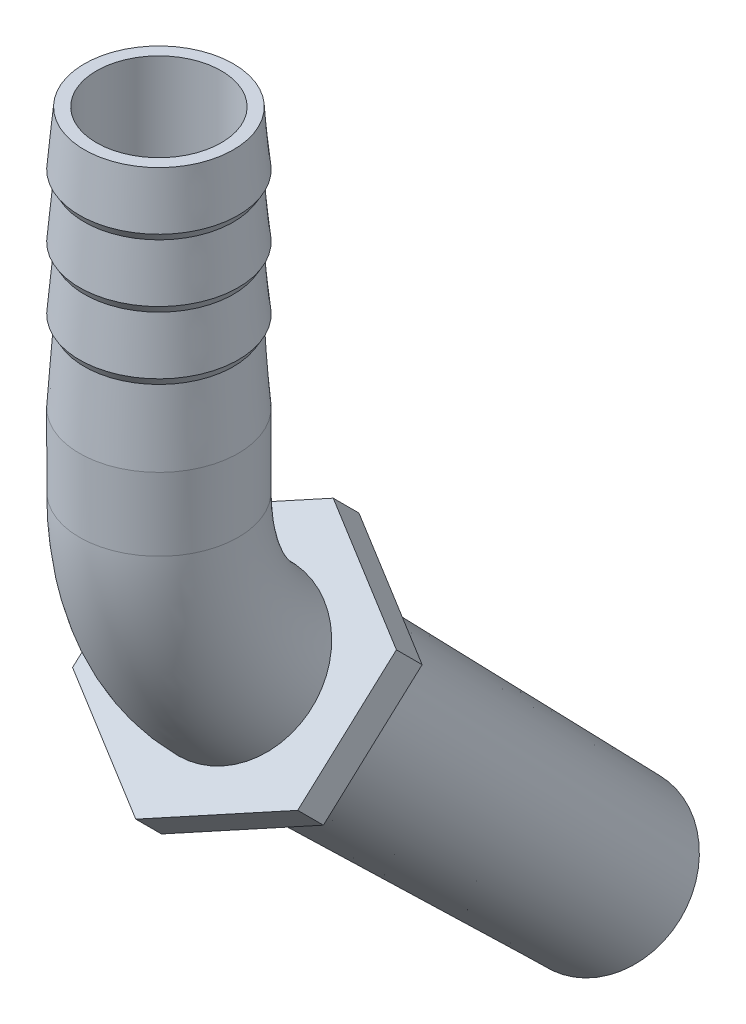
ISO-10303-21;
HEADER;
FILE_DESCRIPTION(('STEP AP214'),'2;1');
FILE_NAME('part.step','',(''),(''),'','','');
FILE_SCHEMA(('AUTOMOTIVE_DESIGN { 1 0 10303 214 1 1 1 1 }'));
ENDSEC;
DATA;
#1=APPLICATION_CONTEXT('core data for automotive mechanical design processes');
#2=APPLICATION_PROTOCOL_DEFINITION('international standard','automotive_design',2000,#1);
#3=PRODUCT_CONTEXT('',#1,'mechanical');
#4=PRODUCT('Part','Part','',(#3));
#5=PRODUCT_RELATED_PRODUCT_CATEGORY('part','',(#4));
#6=PRODUCT_DEFINITION_FORMATION('','',#4);
#7=PRODUCT_DEFINITION_CONTEXT('part definition',#1,'design');
#8=PRODUCT_DEFINITION('design','',#6,#7);
#9=PRODUCT_DEFINITION_SHAPE('','',#8);
#10=(LENGTH_UNIT() NAMED_UNIT(*) SI_UNIT(.MILLI.,.METRE.));
#11=(NAMED_UNIT(*) PLANE_ANGLE_UNIT() SI_UNIT($,.RADIAN.));
#12=(NAMED_UNIT(*) SI_UNIT($,.STERADIAN.) SOLID_ANGLE_UNIT());
#13=UNCERTAINTY_MEASURE_WITH_UNIT(LENGTH_MEASURE(1.E-05),#10,'distance_accuracy_value','');
#14=(GEOMETRIC_REPRESENTATION_CONTEXT(3) GLOBAL_UNCERTAINTY_ASSIGNED_CONTEXT((#13)) GLOBAL_UNIT_ASSIGNED_CONTEXT((#10,
#11,#12)) REPRESENTATION_CONTEXT('',''));
#15=CARTESIAN_POINT('',(0.,0.,0.));
#16=DIRECTION('',(0.,0.,1.));
#17=DIRECTION('',(1.,0.,0.));
#18=AXIS2_PLACEMENT_3D('',#15,#16,#17);
#19=CARTESIAN_POINT('',(3.25,47.7,0.));
#20=DIRECTION('',(0.,1.,0.));
#21=DIRECTION('',(0.,0.,1.));
#22=AXIS2_PLACEMENT_3D('',#19,#20,#21);
#23=PLANE('',#22);
#24=CARTESIAN_POINT('',(0.,47.7,0.));
#25=DIRECTION('',(0.,1.,0.));
#26=DIRECTION('',(0.,0.,1.));
#27=AXIS2_PLACEMENT_3D('',#24,#25,#26);
#28=CIRCLE('',#27,5.15);
#29=CARTESIAN_POINT('',(0.,47.7,5.15));
#30=VERTEX_POINT('',#29);
#31=EDGE_CURVE('E149',#30,#30,#28,.T.);
#32=ORIENTED_EDGE('',*,*,#31,.F.);
#33=EDGE_LOOP('',(#32));
#34=FACE_BOUND('',#33,.T.);
#35=CARTESIAN_POINT('',(0.,47.7,0.));
#36=DIRECTION('',(0.,-1.,0.));
#37=DIRECTION('',(0.,0.,-1.));
#38=AXIS2_PLACEMENT_3D('',#35,#36,#37);
#39=CIRCLE('',#38,6.15);
#40=CARTESIAN_POINT('',(0.,47.7,-6.15));
#41=VERTEX_POINT('',#40);
#42=EDGE_CURVE('E44',#41,#41,#39,.T.);
#43=ORIENTED_EDGE('',*,*,#42,.F.);
#44=EDGE_LOOP('',(#43));
#45=FACE_BOUND('',#44,.T.);
#46=ADVANCED_FACE('F36',(#34,#45),#23,.T.);
#47=CARTESIAN_POINT('',(0.,43.217813033797,0.));
#48=DIRECTION('',(0.,-1.,0.));
#49=DIRECTION('',(0.,0.,-1.));
#50=AXIS2_PLACEMENT_3D('',#47,#48,#49);
#51=CONICAL_SURFACE('',#50,6.55,0.0890063623805471);
#52=ORIENTED_EDGE('',*,*,#42,.T.);
#53=EDGE_LOOP('',(#52));
#54=FACE_BOUND('',#53,.T.);
#55=CARTESIAN_POINT('',(0.,43.217813033797,0.));
#56=DIRECTION('',(0.,-1.,0.));
#57=DIRECTION('',(0.,0.,-1.));
#58=AXIS2_PLACEMENT_3D('',#55,#56,#57);
#59=CIRCLE('',#58,6.55);
#60=CARTESIAN_POINT('',(0.,43.217813033797,-6.55));
#61=VERTEX_POINT('',#60);
#62=EDGE_CURVE('E174',#61,#61,#59,.T.);
#63=ORIENTED_EDGE('',*,*,#62,.F.);
#64=EDGE_LOOP('',(#63));
#65=FACE_BOUND('',#64,.T.);
#66=ADVANCED_FACE('F179',(#54,#65),#51,.T.);
#67=CARTESIAN_POINT('',(0.,42.5333333333333,0.));
#68=DIRECTION('',(0.,1.,0.));
#69=DIRECTION('',(0.,0.,1.));
#70=AXIS2_PLACEMENT_3D('',#67,#68,#69);
#71=CONICAL_SURFACE('',#70,6.15,0.528859112138031);
#72=ORIENTED_EDGE('',*,*,#62,.T.);
#73=EDGE_LOOP('',(#72));
#74=FACE_BOUND('',#73,.T.);
#75=CARTESIAN_POINT('',(0.,42.5333333333333,0.));
#76=DIRECTION('',(0.,-1.,0.));
#77=DIRECTION('',(0.,0.,-1.));
#78=AXIS2_PLACEMENT_3D('',#75,#76,#77);
#79=CIRCLE('',#78,6.15);
#80=CARTESIAN_POINT('',(0.,42.5333333333333,-6.15));
#81=VERTEX_POINT('',#80);
#82=EDGE_CURVE('E171',#81,#81,#79,.T.);
#83=ORIENTED_EDGE('',*,*,#82,.F.);
#84=EDGE_LOOP('',(#83));
#85=FACE_BOUND('',#84,.T.);
#86=ADVANCED_FACE('F187',(#74,#85),#71,.T.);
#87=CARTESIAN_POINT('',(0.,38.0511463671304,0.));
#88=DIRECTION('',(0.,-1.,0.));
#89=DIRECTION('',(0.,0.,-1.));
#90=AXIS2_PLACEMENT_3D('',#87,#88,#89);
#91=CONICAL_SURFACE('',#90,6.55,0.0890063623805471);
#92=ORIENTED_EDGE('',*,*,#82,.T.);
#93=EDGE_LOOP('',(#92));
#94=FACE_BOUND('',#93,.T.);
#95=CARTESIAN_POINT('',(0.,38.0511463671304,0.));
#96=DIRECTION('',(0.,-1.,0.));
#97=DIRECTION('',(0.,0.,-1.));
#98=AXIS2_PLACEMENT_3D('',#95,#96,#97);
#99=CIRCLE('',#98,6.55);
#100=CARTESIAN_POINT('',(0.,38.0511463671304,-6.55));
#101=VERTEX_POINT('',#100);
#102=EDGE_CURVE('E168',#101,#101,#99,.T.);
#103=ORIENTED_EDGE('',*,*,#102,.F.);
#104=EDGE_LOOP('',(#103));
#105=FACE_BOUND('',#104,.T.);
#106=ADVANCED_FACE('F234',(#94,#105),#91,.T.);
#107=CARTESIAN_POINT('',(0.,37.3666666666667,0.));
#108=DIRECTION('',(0.,1.,0.));
#109=DIRECTION('',(0.,0.,1.));
#110=AXIS2_PLACEMENT_3D('',#107,#108,#109);
#111=CONICAL_SURFACE('',#110,6.15,0.528859112138035);
#112=ORIENTED_EDGE('',*,*,#102,.T.);
#113=EDGE_LOOP('',(#112));
#114=FACE_BOUND('',#113,.T.);
#115=CARTESIAN_POINT('',(0.,37.3666666666667,0.));
#116=DIRECTION('',(0.,-1.,0.));
#117=DIRECTION('',(0.,0.,-1.));
#118=AXIS2_PLACEMENT_3D('',#115,#116,#117);
#119=CIRCLE('',#118,6.15);
#120=CARTESIAN_POINT('',(0.,37.3666666666667,-6.15));
#121=VERTEX_POINT('',#120);
#122=EDGE_CURVE('E165',#121,#121,#119,.T.);
#123=ORIENTED_EDGE('',*,*,#122,.F.);
#124=EDGE_LOOP('',(#123));
#125=FACE_BOUND('',#124,.T.);
#126=ADVANCED_FACE('F230',(#114,#125),#111,.T.);
#127=CARTESIAN_POINT('',(0.,32.8844797004637,0.));
#128=DIRECTION('',(0.,-1.,0.));
#129=DIRECTION('',(0.,0.,-1.));
#130=AXIS2_PLACEMENT_3D('',#127,#128,#129);
#131=CONICAL_SURFACE('',#130,6.55,0.089006362380547);
#132=ORIENTED_EDGE('',*,*,#122,.T.);
#133=EDGE_LOOP('',(#132));
#134=FACE_BOUND('',#133,.T.);
#135=CARTESIAN_POINT('',(0.,32.8844797004637,0.));
#136=DIRECTION('',(0.,-1.,0.));
#137=DIRECTION('',(0.,0.,-1.));
#138=AXIS2_PLACEMENT_3D('',#135,#136,#137);
#139=CIRCLE('',#138,6.55);
#140=CARTESIAN_POINT('',(0.,32.8844797004637,-6.55));
#141=VERTEX_POINT('',#140);
#142=EDGE_CURVE('E162',#141,#141,#139,.T.);
#143=ORIENTED_EDGE('',*,*,#142,.F.);
#144=EDGE_LOOP('',(#143));
#145=FACE_BOUND('',#144,.T.);
#146=ADVANCED_FACE('F226',(#134,#145),#131,.T.);
#147=CARTESIAN_POINT('',(0.,32.2,0.));
#148=DIRECTION('',(0.,1.,0.));
#149=DIRECTION('',(0.,0.,1.));
#150=AXIS2_PLACEMENT_3D('',#147,#148,#149);
#151=CONICAL_SURFACE('',#150,6.15,0.528859112138035);
#152=ORIENTED_EDGE('',*,*,#142,.T.);
#153=EDGE_LOOP('',(#152));
#154=FACE_BOUND('',#153,.T.);
#155=CARTESIAN_POINT('',(0.,32.2,0.));
#156=DIRECTION('',(0.,-1.,0.));
#157=DIRECTION('',(0.,0.,-1.));
#158=AXIS2_PLACEMENT_3D('',#155,#156,#157);
#159=CIRCLE('',#158,6.15);
#160=CARTESIAN_POINT('',(0.,32.2,-6.15));
#161=VERTEX_POINT('',#160);
#162=EDGE_CURVE('E159',#161,#161,#159,.T.);
#163=ORIENTED_EDGE('',*,*,#162,.F.);
#164=EDGE_LOOP('',(#163));
#165=FACE_BOUND('',#164,.T.);
#166=ADVANCED_FACE('F222',(#154,#165),#151,.T.);
#167=CARTESIAN_POINT('',(0.,26.2,0.));
#168=DIRECTION('',(0.,-1.,0.));
#169=DIRECTION('',(0.,0.,-1.));
#170=AXIS2_PLACEMENT_3D('',#167,#168,#169);
#171=CONICAL_SURFACE('',#170,6.55,0.0665681637758236);
#172=ORIENTED_EDGE('',*,*,#162,.T.);
#173=EDGE_LOOP('',(#172));
#174=FACE_BOUND('',#173,.T.);
#175=CARTESIAN_POINT('',(0.,26.2,0.));
#176=DIRECTION('',(0.,-1.,0.));
#177=DIRECTION('',(0.,0.,-1.));
#178=AXIS2_PLACEMENT_3D('',#175,#176,#177);
#179=CIRCLE('',#178,6.55);
#180=CARTESIAN_POINT('',(0.,26.2,-6.55));
#181=VERTEX_POINT('',#180);
#182=EDGE_CURVE('E156',#181,#181,#179,.T.);
#183=ORIENTED_EDGE('',*,*,#182,.F.);
#184=EDGE_LOOP('',(#183));
#185=FACE_BOUND('',#184,.T.);
#186=ADVANCED_FACE('F218',(#174,#185),#171,.T.);
#187=CARTESIAN_POINT('',(0.,0.,0.));
#188=DIRECTION('',(0.,-1.,0.));
#189=DIRECTION('',(0.,0.,-1.));
#190=AXIS2_PLACEMENT_3D('',#187,#188,#189);
#191=CYLINDRICAL_SURFACE('',#190,6.55);
#192=ORIENTED_EDGE('',*,*,#182,.T.);
#193=EDGE_LOOP('',(#192));
#194=FACE_BOUND('',#193,.T.);
#195=CARTESIAN_POINT('',(0.,20.2,0.));
#196=DIRECTION('',(0.,-1.,0.));
#197=DIRECTION('',(0.,0.,-1.));
#198=AXIS2_PLACEMENT_3D('',#195,#196,#197);
#199=CIRCLE('',#198,6.55);
#200=CARTESIAN_POINT('',(0.,20.2,6.55));
#201=VERTEX_POINT('',#200);
#202=EDGE_CURVE('E141',#201,#201,#199,.T.);
#203=ORIENTED_EDGE('',*,*,#202,.F.);
#204=EDGE_LOOP('',(#203));
#205=FACE_BOUND('',#204,.T.);
#206=ADVANCED_FACE('F194',(#194,#205),#191,.T.);
#207=CARTESIAN_POINT('',(0.,7.63360030755712,0.));
#208=DIRECTION('',(0.,1.,0.));
#209=DIRECTION('',(0.,0.,1.));
#210=AXIS2_PLACEMENT_3D('',#207,#208,#209);
#211=CYLINDRICAL_SURFACE('',#210,5.15);
#212=ORIENTED_EDGE('',*,*,#31,.T.);
#213=EDGE_LOOP('',(#212));
#214=FACE_BOUND('',#213,.T.);
#215=CARTESIAN_POINT('',(0.,20.2,0.));
#216=DIRECTION('',(0.,-1.,0.));
#217=DIRECTION('',(0.,0.,-1.));
#218=AXIS2_PLACEMENT_3D('',#215,#216,#217);
#219=CIRCLE('',#218,5.15);
#220=CARTESIAN_POINT('',(0.,20.2,5.15000000000001));
#221=VERTEX_POINT('',#220);
#222=EDGE_CURVE('E142',#221,#221,#219,.F.);
#223=ORIENTED_EDGE('',*,*,#222,.F.);
#224=EDGE_LOOP('',(#223));
#225=FACE_BOUND('',#224,.T.);
#226=ADVANCED_FACE('F190',(#214,#225),#211,.F.);
#227=CARTESIAN_POINT('',(0.,20.2,-21.3022261236142));
#228=DIRECTION('',(1.,0.,0.));
#229=DIRECTION('',(0.,0.,-1.));
#230=AXIS2_PLACEMENT_3D('',#227,#228,#229);
#231=TOROIDAL_SURFACE('',#230,21.3022261236142,6.55);
#232=CARTESIAN_POINT('',(0.,5.13705145362328,-6.23927757723729));
#233=DIRECTION('',(0.,-0.707106781186551,-0.707106781186544));
#234=DIRECTION('',(0.,0.707106781186544,-0.707106781186551));
#235=AXIS2_PLACEMENT_3D('',#232,#233,#234);
#236=CIRCLE('',#235,6.55);
#237=CARTESIAN_POINT('',(0.,0.505502036851416,-1.60772816046538));
#238=VERTEX_POINT('',#237);
#239=EDGE_CURVE('E146',#238,#238,#236,.T.);
#240=CARTESIAN_POINT('',(0.,20.2,-21.3022261236142));
#241=DIRECTION('',(1.,0.,0.));
#242=DIRECTION('',(0.,0.,-1.));
#243=AXIS2_PLACEMENT_3D('',#240,#241,#242);
#244=CIRCLE('',#243,27.8522261236142);
#245=EDGE_CURVE('',#201,#238,#244,.T.);
#246=ORIENTED_EDGE('',*,*,#202,.T.);
#247=ORIENTED_EDGE('',*,*,#239,.F.);
#248=ORIENTED_EDGE('',*,*,#245,.T.);
#249=ORIENTED_EDGE('',*,*,#245,.F.);
#250=EDGE_LOOP('',(#246,#248,#247,#249));
#251=FACE_BOUND('',#250,.T.);
#252=ADVANCED_FACE('F193',(#251),#231,.T.);
#253=CARTESIAN_POINT('',(0.,20.2,-21.3022261236142));
#254=DIRECTION('',(1.,0.,0.));
#255=DIRECTION('',(0.,0.,-1.));
#256=AXIS2_PLACEMENT_3D('',#253,#254,#255);
#257=TOROIDAL_SURFACE('',#256,21.3022261236142,5.15);
#258=CARTESIAN_POINT('',(0.,5.13705145362328,-6.23927757723729));
#259=DIRECTION('',(0.,-0.707106781186551,-0.707106781186544));
#260=DIRECTION('',(0.,0.707106781186544,-0.707106781186551));
#261=AXIS2_PLACEMENT_3D('',#258,#259,#260);
#262=CIRCLE('',#261,5.15);
#263=CARTESIAN_POINT('',(0.,1.49545153051258,-2.59767765412655));
#264=VERTEX_POINT('',#263);
#265=EDGE_CURVE('E145',#264,#264,#262,.F.);
#266=CARTESIAN_POINT('',(0.,20.2,-21.3022261236142));
#267=DIRECTION('',(1.,0.,0.));
#268=DIRECTION('',(0.,0.,-1.));
#269=AXIS2_PLACEMENT_3D('',#266,#267,#268);
#270=CIRCLE('',#269,26.4522261236142);
#271=EDGE_CURVE('',#221,#264,#270,.T.);
#272=ORIENTED_EDGE('',*,*,#222,.T.);
#273=ORIENTED_EDGE('',*,*,#265,.F.);
#274=ORIENTED_EDGE('',*,*,#271,.T.);
#275=ORIENTED_EDGE('',*,*,#271,.F.);
#276=EDGE_LOOP('',(#272,#274,#273,#275));
#277=FACE_BOUND('',#276,.T.);
#278=ADVANCED_FACE('F196',(#277),#257,.F.);
#279=CARTESIAN_POINT('',(0.,-2.67243340536663,-2.67243340536661));
#280=DIRECTION('',(0.,-0.707106781186551,-0.707106781186544));
#281=DIRECTION('',(0.,0.707106781186544,-0.707106781186551));
#282=AXIS2_PLACEMENT_3D('',#279,#280,#281);
#283=PLANE('',#282);
#284=CARTESIAN_POINT('',(0.,3.01573111006362,-8.36059792079695));
#285=DIRECTION('',(0.,-0.707106781186551,-0.707106781186544));
#286=DIRECTION('',(0.,0.707106781186544,-0.707106781186551));
#287=AXIS2_PLACEMENT_3D('',#284,#285,#286);
#288=CIRCLE('',#287,7.15);
#289=CARTESIAN_POINT('',(0.,8.0715445955474,-13.4164114062808));
#290=VERTEX_POINT('',#289);
#291=EDGE_CURVE('E12',#290,#290,#288,.T.);
#292=ORIENTED_EDGE('',*,*,#291,.F.);
#293=EDGE_LOOP('',(#292));
#294=FACE_BOUND('',#293,.T.);
#295=DIRECTION('',(0.848471634680625,-0.374229799149122,0.374229799149126));
#296=VECTOR('',#295,1.);
#297=CARTESIAN_POINT('',(0.375051930091136,10.7883380102527,-16.1332048209861));
#298=LINE('',#297,#296);
#299=CARTESIAN_POINT('',(0.375051930091136,10.7883380102527,-16.1332048209861));
#300=VERTEX_POINT('',#299);
#301=CARTESIAN_POINT('',(9.70698640339507,6.67236309621584,-12.0172299069492));
#302=VERTEX_POINT('',#301);
#303=EDGE_CURVE('E132',#300,#302,#298,.T.);
#304=ORIENTED_EDGE('',*,*,#303,.T.);
#305=DIRECTION('',(-0.034100209889482,-0.706695541122725,0.706695541122733));
#306=VECTOR('',#305,1.);
#307=CARTESIAN_POINT('',(9.70698640339507,6.67236309621584,-12.0172299069492));
#308=LINE('',#307,#306);
#309=CARTESIAN_POINT('',(9.33193447330393,-1.10024380397324,-4.24462300676002));
#310=VERTEX_POINT('',#309);
#311=EDGE_CURVE('E90',#302,#310,#308,.T.);
#312=ORIENTED_EDGE('',*,*,#311,.T.);
#313=DIRECTION('',(-0.882571844570107,-0.332465741973603,0.332465741973607));
#314=VECTOR('',#313,1.);
#315=CARTESIAN_POINT('',(9.33193447330393,-1.10024380397324,-4.24462300676002));
#316=LINE('',#315,#314);
#317=CARTESIAN_POINT('',(-0.375051930091139,-4.75687579012545,-0.587991020607762));
#318=VERTEX_POINT('',#317);
#319=EDGE_CURVE('E103',#310,#318,#316,.T.);
#320=ORIENTED_EDGE('',*,*,#319,.T.);
#321=DIRECTION('',(-0.848471634680625,0.374229799149122,-0.374229799149126));
#322=VECTOR('',#321,1.);
#323=CARTESIAN_POINT('',(-0.375051930091139,-4.75687579012545,-0.587991020607762));
#324=LINE('',#323,#322);
#325=CARTESIAN_POINT('',(-9.70698640339507,-0.640900876088596,-4.70396593464466));
#326=VERTEX_POINT('',#325);
#327=EDGE_CURVE('E97',#318,#326,#324,.T.);
#328=ORIENTED_EDGE('',*,*,#327,.T.);
#329=DIRECTION('',(0.034100209889482,0.706695541122725,-0.706695541122733));
#330=VECTOR('',#329,1.);
#331=CARTESIAN_POINT('',(-9.70698640339507,-0.640900876088596,-4.70396593464466));
#332=LINE('',#331,#330);
#333=CARTESIAN_POINT('',(-9.33193447330393,7.13170602410048,-12.4765728348338));
#334=VERTEX_POINT('',#333);
#335=EDGE_CURVE('E101',#326,#334,#332,.T.);
#336=ORIENTED_EDGE('',*,*,#335,.T.);
#337=DIRECTION('',(0.882571844570107,0.332465741973603,-0.332465741973607));
#338=VECTOR('',#337,1.);
#339=CARTESIAN_POINT('',(-9.33193447330393,7.13170602410048,-12.4765728348338));
#340=LINE('',#339,#338);
#341=EDGE_CURVE('E52',#334,#300,#340,.T.);
#342=ORIENTED_EDGE('',*,*,#341,.T.);
#343=EDGE_LOOP('',(#304,#312,#320,#328,#336,#342));
#344=FACE_BOUND('',#343,.T.);
#345=ADVANCED_FACE('F99',(#294,#344),#283,.T.);
#346=CARTESIAN_POINT('',(0.,-0.55111306180698,-0.551113061806974));
#347=DIRECTION('',(0.,-0.707106781186551,-0.707106781186544));
#348=DIRECTION('',(0.,0.707106781186544,-0.707106781186551));
#349=AXIS2_PLACEMENT_3D('',#346,#347,#348);
#350=PLANE('',#349);
#351=ORIENTED_EDGE('',*,*,#239,.T.);
#352=EDGE_LOOP('',(#351));
#353=FACE_BOUND('',#352,.T.);
#354=DIRECTION('',(0.848471634680625,-0.374229799149122,0.374229799149126));
#355=VECTOR('',#354,1.);
#356=CARTESIAN_POINT('',(0.375051930091136,12.9096583538124,-14.0118844774265));
#357=LINE('',#356,#355);
#358=CARTESIAN_POINT('',(0.375051930091136,12.9096583538124,-14.0118844774265));
#359=VERTEX_POINT('',#358);
#360=CARTESIAN_POINT('',(9.70698640339507,8.79368343977549,-9.89590956338955));
#361=VERTEX_POINT('',#360);
#362=EDGE_CURVE('E121',#359,#361,#357,.T.);
#363=ORIENTED_EDGE('',*,*,#362,.F.);
#364=DIRECTION('',(0.882571844570107,0.332465741973603,-0.332465741973607));
#365=VECTOR('',#364,1.);
#366=CARTESIAN_POINT('',(-9.33193447330393,9.25302636766014,-10.3552524912742));
#367=LINE('',#366,#365);
#368=CARTESIAN_POINT('',(-9.33193447330393,9.25302636766014,-10.3552524912742));
#369=VERTEX_POINT('',#368);
#370=EDGE_CURVE('E81',#369,#359,#367,.T.);
#371=ORIENTED_EDGE('',*,*,#370,.F.);
#372=DIRECTION('',(0.034100209889482,0.706695541122725,-0.706695541122733));
#373=VECTOR('',#372,1.);
#374=CARTESIAN_POINT('',(-9.70698640339507,1.48041946747106,-2.58264559108503));
#375=LINE('',#374,#373);
#376=CARTESIAN_POINT('',(-9.70698640339507,1.48041946747106,-2.58264559108503));
#377=VERTEX_POINT('',#376);
#378=EDGE_CURVE('E75',#377,#369,#375,.T.);
#379=ORIENTED_EDGE('',*,*,#378,.F.);
#380=DIRECTION('',(-0.848471634680625,0.374229799149122,-0.374229799149126));
#381=VECTOR('',#380,1.);
#382=CARTESIAN_POINT('',(-0.375051930091139,-2.6355554465658,1.53332932295187));
#383=LINE('',#382,#381);
#384=CARTESIAN_POINT('',(-0.375051930091139,-2.6355554465658,1.53332932295187));
#385=VERTEX_POINT('',#384);
#386=EDGE_CURVE('E111',#385,#377,#383,.T.);
#387=ORIENTED_EDGE('',*,*,#386,.F.);
#388=DIRECTION('',(-0.882571844570107,-0.332465741973603,0.332465741973607));
#389=VECTOR('',#388,1.);
#390=CARTESIAN_POINT('',(9.33193447330393,1.02107653958642,-2.12330266320039));
#391=LINE('',#390,#389);
#392=CARTESIAN_POINT('',(9.33193447330393,1.02107653958642,-2.12330266320039));
#393=VERTEX_POINT('',#392);
#394=EDGE_CURVE('E127',#393,#385,#391,.T.);
#395=ORIENTED_EDGE('',*,*,#394,.F.);
#396=DIRECTION('',(-0.034100209889482,-0.706695541122725,0.706695541122733));
#397=VECTOR('',#396,1.);
#398=CARTESIAN_POINT('',(9.70698640339507,8.79368343977549,-9.89590956338955));
#399=LINE('',#398,#397);
#400=EDGE_CURVE('E124',#361,#393,#399,.T.);
#401=ORIENTED_EDGE('',*,*,#400,.F.);
#402=EDGE_LOOP('',(#363,#371,#379,#387,#395,#401));
#403=FACE_BOUND('',#402,.T.);
#404=ADVANCED_FACE('F206',(#353,#403),#350,.F.);
#405=CARTESIAN_POINT('',(0.375051930091136,10.7883380102527,-16.1332048209861));
#406=DIRECTION('',(-0.529240857400851,-0.599960046527102,0.599960046527108));
#407=DIRECTION('',(0.,-0.707106781186551,-0.707106781186544));
#408=AXIS2_PLACEMENT_3D('',#405,#406,#407);
#409=PLANE('',#408);
#410=ORIENTED_EDGE('',*,*,#362,.T.);
#411=DIRECTION('',(0.,0.707106781186551,0.707106781186544));
#412=VECTOR('',#411,1.);
#413=CARTESIAN_POINT('',(9.70698640339507,6.67236309621584,-12.0172299069492));
#414=LINE('',#413,#412);
#415=EDGE_CURVE('E139',#302,#361,#414,.T.);
#416=ORIENTED_EDGE('',*,*,#415,.F.);
#417=ORIENTED_EDGE('',*,*,#303,.F.);
#418=DIRECTION('',(0.,0.707106781186551,0.707106781186544));
#419=VECTOR('',#418,1.);
#420=CARTESIAN_POINT('',(0.375051930091136,10.7883380102527,-16.1332048209861));
#421=LINE('',#420,#419);
#422=EDGE_CURVE('E117',#300,#359,#421,.T.);
#423=ORIENTED_EDGE('',*,*,#422,.T.);
#424=EDGE_LOOP('',(#410,#416,#417,#423));
#425=FACE_BOUND('',#424,.T.);
#426=ADVANCED_FACE('F213',(#425),#409,.F.);
#427=CARTESIAN_POINT('',(9.70698640339507,6.67236309621584,-12.0172299069492));
#428=DIRECTION('',(-0.999418418724357,0.0241124896527372,-0.0241124896527374));
#429=DIRECTION('',(-0.0241195023581527,0.,0.999709082486498));
#430=AXIS2_PLACEMENT_3D('',#427,#428,#429);
#431=PLANE('',#430);
#432=ORIENTED_EDGE('',*,*,#400,.T.);
#433=DIRECTION('',(0.,0.707106781186551,0.707106781186544));
#434=VECTOR('',#433,1.);
#435=CARTESIAN_POINT('',(9.33193447330393,-1.10024380397324,-4.24462300676002));
#436=LINE('',#435,#434);
#437=EDGE_CURVE('E136',#310,#393,#436,.T.);
#438=ORIENTED_EDGE('',*,*,#437,.F.);
#439=ORIENTED_EDGE('',*,*,#311,.F.);
#440=ORIENTED_EDGE('',*,*,#415,.T.);
#441=EDGE_LOOP('',(#432,#438,#439,#440));
#442=FACE_BOUND('',#441,.T.);
#443=ADVANCED_FACE('F316',(#442),#431,.F.);
#444=CARTESIAN_POINT('',(9.33193447330393,-1.10024380397324,-4.24462300676002));
#445=DIRECTION('',(-0.470177561323506,0.624072536179839,-0.624072536179846));
#446=DIRECTION('',(0.,0.707106781186551,0.707106781186544));
#447=AXIS2_PLACEMENT_3D('',#444,#445,#446);
#448=PLANE('',#447);
#449=ORIENTED_EDGE('',*,*,#394,.T.);
#450=DIRECTION('',(0.,0.707106781186551,0.707106781186544));
#451=VECTOR('',#450,1.);
#452=CARTESIAN_POINT('',(-0.375051930091139,-4.75687579012545,-0.587991020607762));
#453=LINE('',#452,#451);
#454=EDGE_CURVE('E112',#318,#385,#453,.T.);
#455=ORIENTED_EDGE('',*,*,#454,.F.);
#456=ORIENTED_EDGE('',*,*,#319,.F.);
#457=ORIENTED_EDGE('',*,*,#437,.T.);
#458=EDGE_LOOP('',(#449,#455,#456,#457));
#459=FACE_BOUND('',#458,.T.);
#460=ADVANCED_FACE('F325',(#459),#448,.F.);
#461=CARTESIAN_POINT('',(-0.375051930091139,-4.75687579012545,-0.587991020607762));
#462=DIRECTION('',(0.529240857400851,0.599960046527102,-0.599960046527108));
#463=DIRECTION('',(0.,0.707106781186551,0.707106781186544));
#464=AXIS2_PLACEMENT_3D('',#461,#462,#463);
#465=PLANE('',#464);
#466=ORIENTED_EDGE('',*,*,#386,.T.);
#467=DIRECTION('',(0.,0.707106781186551,0.707106781186544));
#468=VECTOR('',#467,1.);
#469=CARTESIAN_POINT('',(-9.70698640339507,-0.640900876088596,-4.70396593464466));
#470=LINE('',#469,#468);
#471=EDGE_CURVE('E108',#326,#377,#470,.T.);
#472=ORIENTED_EDGE('',*,*,#471,.F.);
#473=ORIENTED_EDGE('',*,*,#327,.F.);
#474=ORIENTED_EDGE('',*,*,#454,.T.);
#475=EDGE_LOOP('',(#466,#472,#473,#474));
#476=FACE_BOUND('',#475,.T.);
#477=ADVANCED_FACE('F109',(#476),#465,.F.);
#478=CARTESIAN_POINT('',(-9.70698640339507,-0.640900876088596,-4.70396593464466));
#479=DIRECTION('',(0.999418418724357,-0.0241124896527372,0.0241124896527374));
#480=DIRECTION('',(0.0241195023581526,0.,-0.999709082486498));
#481=AXIS2_PLACEMENT_3D('',#478,#479,#480);
#482=PLANE('',#481);
#483=ORIENTED_EDGE('',*,*,#378,.T.);
#484=DIRECTION('',(0.,0.707106781186551,0.707106781186544));
#485=VECTOR('',#484,1.);
#486=CARTESIAN_POINT('',(-9.33193447330393,7.13170602410048,-12.4765728348338));
#487=LINE('',#486,#485);
#488=EDGE_CURVE('E113',#334,#369,#487,.T.);
#489=ORIENTED_EDGE('',*,*,#488,.F.);
#490=ORIENTED_EDGE('',*,*,#335,.F.);
#491=ORIENTED_EDGE('',*,*,#471,.T.);
#492=EDGE_LOOP('',(#483,#489,#490,#491));
#493=FACE_BOUND('',#492,.T.);
#494=ADVANCED_FACE('F115',(#493),#482,.F.);
#495=CARTESIAN_POINT('',(-9.33193447330393,7.13170602410048,-12.4765728348338));
#496=DIRECTION('',(0.470177561323506,-0.624072536179839,0.624072536179845));
#497=DIRECTION('',(0.,-0.707106781186551,-0.707106781186544));
#498=AXIS2_PLACEMENT_3D('',#495,#496,#497);
#499=PLANE('',#498);
#500=ORIENTED_EDGE('',*,*,#370,.T.);
#501=ORIENTED_EDGE('',*,*,#422,.F.);
#502=ORIENTED_EDGE('',*,*,#341,.F.);
#503=ORIENTED_EDGE('',*,*,#488,.T.);
#504=EDGE_LOOP('',(#500,#501,#502,#503));
#505=FACE_BOUND('',#504,.T.);
#506=ADVANCED_FACE('F350',(#505),#499,.F.);
#507=CARTESIAN_POINT('',(0.,3.01573111006363,-8.36059792079693));
#508=DIRECTION('',(0.,0.707106781186551,0.707106781186544));
#509=DIRECTION('',(0.,-0.707106781186544,0.707106781186551));
#510=AXIS2_PLACEMENT_3D('',#507,#508,#509);
#511=CYLINDRICAL_SURFACE('',#510,5.15);
#512=CARTESIAN_POINT('',(0.,3.01573111006363,-8.36059792079693));
#513=DIRECTION('',(0.,-0.707106781186551,-0.707106781186544));
#514=DIRECTION('',(0.,0.707106781186544,-0.707106781186551));
#515=AXIS2_PLACEMENT_3D('',#512,#513,#514);
#516=CIRCLE('',#515,5.15);
#517=CARTESIAN_POINT('',(0.,-0.625868813047075,-4.71899799768619));
#518=VERTEX_POINT('',#517);
#519=EDGE_CURVE('E413',#518,#518,#516,.T.);
#520=CARTESIAN_POINT('',(0.,-0.625868813047075,-4.71899799768619));
#521=CARTESIAN_POINT('',(0.,-0.603771726134995,-4.69690091077411));
#522=CARTESIAN_POINT('',(0.,-0.581674639222915,-4.67480382386203));
#523=CARTESIAN_POINT('',(0.,-0.537480465398756,-4.63060965003787));
#524=CARTESIAN_POINT('',(0.,-0.515383378486676,-4.60851256312579));
#525=CARTESIAN_POINT('',(0.,-0.471189204662516,-4.56431838930163));
#526=CARTESIAN_POINT('',(0.,-0.449092117750437,-4.54222130238955));
#527=CARTESIAN_POINT('',(0.,-0.404897943926277,-4.49802712856539));
#528=CARTESIAN_POINT('',(0.,-0.382800857014198,-4.47593004165331));
#529=CARTESIAN_POINT('',(0.,-0.338606683190038,-4.43173586782915));
#530=CARTESIAN_POINT('',(0.,-0.316509596277958,-4.40963878091707));
#531=CARTESIAN_POINT('',(0.,-0.272315422453799,-4.36544460709291));
#532=CARTESIAN_POINT('',(0.,-0.250218335541719,-4.34334752018083));
#533=CARTESIAN_POINT('',(0.,-0.20602416171756,-4.29915334635668));
#534=CARTESIAN_POINT('',(0.,-0.18392707480548,-4.2770562594446));
#535=CARTESIAN_POINT('',(0.,-0.13973290098132,-4.23286208562044));
#536=CARTESIAN_POINT('',(0.,-0.117635814069241,-4.21076499870836));
#537=CARTESIAN_POINT('',(0.,-0.0734416402450812,-4.1665708248842));
#538=CARTESIAN_POINT('',(0.,-0.0513445533330014,-4.14447373797212));
#539=CARTESIAN_POINT('',(0.,-0.00715037950884195,-4.10027956414796));
#540=CARTESIAN_POINT('',(0.,0.0149467074032378,-4.07818247723588));
#541=CARTESIAN_POINT('',(0.,0.0591408812273972,-4.03398830341172));
#542=CARTESIAN_POINT('',(0.,0.081237968139477,-4.01189121649964));
#543=CARTESIAN_POINT('',(0.,0.125432141963636,-3.96769704267548));
#544=CARTESIAN_POINT('',(0.,0.147529228875716,-3.9455999557634));
#545=CARTESIAN_POINT('',(0.,0.191723402699876,-3.90140578193924));
#546=CARTESIAN_POINT('',(0.,0.213820489611955,-3.87930869502716));
#547=CARTESIAN_POINT('',(0.,0.258014663436115,-3.83511452120301));
#548=CARTESIAN_POINT('',(0.,0.280111750348195,-3.81301743429093));
#549=CARTESIAN_POINT('',(0.,0.324305924172354,-3.76882326046677));
#550=CARTESIAN_POINT('',(0.,0.346403011084434,-3.74672617355469));
#551=CARTESIAN_POINT('',(0.,0.390597184908593,-3.70253199973053));
#552=CARTESIAN_POINT('',(0.,0.412694271820673,-3.68043491281845));
#553=CARTESIAN_POINT('',(0.,0.456888445644833,-3.63624073899429));
#554=CARTESIAN_POINT('',(0.,0.478985532556912,-3.61414365208221));
#555=CARTESIAN_POINT('',(0.,0.523179706381072,-3.56994947825805));
#556=CARTESIAN_POINT('',(0.,0.545276793293152,-3.54785239134597));
#557=CARTESIAN_POINT('',(0.,0.589470967117311,-3.50365821752181));
#558=CARTESIAN_POINT('',(0.,0.611568054029391,-3.48156113060973));
#559=CARTESIAN_POINT('',(0.,0.65576222785355,-3.43736695678558));
#560=CARTESIAN_POINT('',(0.,0.67785931476563,-3.4152698698735));
#561=CARTESIAN_POINT('',(0.,0.722053488589789,-3.37107569604934));
#562=CARTESIAN_POINT('',(0.,0.744150575501869,-3.34897860913726));
#563=CARTESIAN_POINT('',(0.,0.788344749326029,-3.3047844353131));
#564=CARTESIAN_POINT('',(0.,0.810441836238108,-3.28268734840102));
#565=CARTESIAN_POINT('',(0.,0.854636010062268,-3.23849317457686));
#566=CARTESIAN_POINT('',(0.,0.876733096974348,-3.21639608766478));
#567=CARTESIAN_POINT('',(0.,0.920927270798507,-3.17220191384062));
#568=CARTESIAN_POINT('',(0.,0.943024357710587,-3.15010482692854));
#569=CARTESIAN_POINT('',(0.,0.987218531534746,-3.10591065310438));
#570=CARTESIAN_POINT('',(0.,1.00931561844683,-3.0838135661923));
#571=CARTESIAN_POINT('',(0.,1.05350979227099,-3.03961939236814));
#572=CARTESIAN_POINT('',(0.,1.07560687918307,-3.01752230545606));
#573=CARTESIAN_POINT('',(0.,1.11980105300722,-2.97332813163191));
#574=CARTESIAN_POINT('',(0.,1.1418981399193,-2.95123104471983));
#575=CARTESIAN_POINT('',(0.,1.18609231374346,-2.90703687089567));
#576=CARTESIAN_POINT('',(0.,1.20818940065554,-2.88493978398359));
#577=CARTESIAN_POINT('',(0.,1.2523835744797,-2.84074561015943));
#578=CARTESIAN_POINT('',(0.,1.27448066139178,-2.81864852324735));
#579=CARTESIAN_POINT('',(0.,1.31867483521594,-2.77445434942319));
#580=CARTESIAN_POINT('',(0.,1.34077192212802,-2.75235726251111));
#581=CARTESIAN_POINT('',(0.,1.38496609595218,-2.70816308868695));
#582=CARTESIAN_POINT('',(0.,1.40706318286426,-2.68606600177487));
#583=CARTESIAN_POINT('',(0.,1.45125735668842,-2.64187182795071));
#584=CARTESIAN_POINT('',(0.,1.4733544436005,-2.61977474103863));
#585=CARTESIAN_POINT('',(0.,1.49545153051258,-2.59767765412655));
#586=B_SPLINE_CURVE_WITH_KNOTS('',3,(#520,#521,#522,#523,#524,#525,#526,#527,#528,#529,#530,
#531,#532,#533,#534,#535,#536,#537,#538,#539,#540,#541,#542,#543,#544,#545,#546,#547,#548,#549,
#550,#551,#552,#553,#554,#555,#556,#557,#558,#559,#560,#561,#562,#563,#564,#565,#566,#567,#568,
#569,#570,#571,#572,#573,#574,#575,#576,#577,#578,#579,#580,#581,#582,#583,#584,#585),
.UNSPECIFIED.,.F.,.F.,(4,2,2,2,2,2,2,2,2,2,2,2,2,2,2,2,2,2,2,2,2,2,2,2,2,2,2,2,2,2,2,2,4),(0.,
0.0937500000000001,0.1875,0.28125,0.375,0.46875,0.562500000000001,0.65625,0.75,0.84375,0.9375,
1.03125,1.125,1.21875,1.3125,1.40625,1.5,1.59375,1.6875,1.78125,1.875,1.96875,2.0625,2.15625,
2.25,2.34375,2.4375,2.53125,2.625,2.71875,2.8125,2.90625,3.),.UNSPECIFIED.);
#587=EDGE_CURVE('BSEAM359',#518,#264,#586,.T.);
#588=ORIENTED_EDGE('',*,*,#519,.T.);
#589=ORIENTED_EDGE('',*,*,#265,.T.);
#590=ORIENTED_EDGE('',*,*,#587,.T.);
#591=ORIENTED_EDGE('',*,*,#587,.F.);
#592=EDGE_LOOP('',(#588,#590,#589,#591));
#593=FACE_BOUND('',#592,.T.);
#594=ADVANCED_FACE('F359',(#593),#511,.F.);
#595=CARTESIAN_POINT('',(0.,-25.2685401373984,-36.6448691682587));
#596=DIRECTION('',(0.,0.707106781186551,0.707106781186544));
#597=DIRECTION('',(0.,-0.707106781186544,0.707106781186551));
#598=AXIS2_PLACEMENT_3D('',#595,#596,#597);
#599=CONICAL_SURFACE('',#598,6.5,0.0162485698880349);
#600=ORIENTED_EDGE('',*,*,#291,.T.);
#601=EDGE_LOOP('',(#600));
#602=FACE_BOUND('',#601,.T.);
#603=CARTESIAN_POINT('',(0.,-25.2685401373984,-36.6448691682587));
#604=DIRECTION('',(0.,-0.707106781186551,-0.707106781186544));
#605=DIRECTION('',(0.,0.707106781186544,-0.707106781186551));
#606=AXIS2_PLACEMENT_3D('',#603,#604,#605);
#607=CIRCLE('',#606,6.5);
#608=CARTESIAN_POINT('',(0.,-20.6723460596859,-41.2410632459713));
#609=VERTEX_POINT('',#608);
#610=EDGE_CURVE('E125',#609,#609,#607,.T.);
#611=ORIENTED_EDGE('',*,*,#610,.F.);
#612=EDGE_LOOP('',(#611));
#613=FACE_BOUND('',#612,.T.);
#614=ADVANCED_FACE('F368',(#602,#613),#599,.T.);
#615=CARTESIAN_POINT('',(5.7367169897057,-23.10751281457,-38.8058964910871));
#616=DIRECTION('',(0.,-0.707106781186551,-0.707106781186544));
#617=DIRECTION('',(0.,0.707106781186544,-0.707106781186551));
#618=AXIS2_PLACEMENT_3D('',#615,#616,#617);
#619=PLANE('',#618);
#620=ORIENTED_EDGE('',*,*,#610,.T.);
#621=EDGE_LOOP('',(#620));
#622=FACE_BOUND('',#621,.T.);
#623=CARTESIAN_POINT('',(0.,-25.2685401373984,-36.6448691682587));
#624=DIRECTION('',(0.,-0.707106781186551,-0.707106781186544));
#625=DIRECTION('',(0.,0.707106781186544,-0.707106781186551));
#626=AXIS2_PLACEMENT_3D('',#623,#624,#625);
#627=CIRCLE('',#626,4.5);
#628=CARTESIAN_POINT('',(0.,-22.086559622059,-39.8268496835982));
#629=VERTEX_POINT('',#628);
#630=EDGE_CURVE('E410',#629,#629,#627,.T.);
#631=ORIENTED_EDGE('',*,*,#630,.F.);
#632=EDGE_LOOP('',(#631));
#633=FACE_BOUND('',#632,.T.);
#634=ADVANCED_FACE('F383',(#622,#633),#619,.T.);
#635=CARTESIAN_POINT('',(0.,3.01573111006363,-8.36059792079693));
#636=DIRECTION('',(0.,0.707106781186551,0.707106781186544));
#637=DIRECTION('',(0.,-0.707106781186544,0.707106781186551));
#638=AXIS2_PLACEMENT_3D('',#635,#636,#637);
#639=CONICAL_SURFACE('',#638,5.15,0.016248569888035);
#640=ORIENTED_EDGE('',*,*,#630,.T.);
#641=EDGE_LOOP('',(#640));
#642=FACE_BOUND('',#641,.T.);
#643=ORIENTED_EDGE('',*,*,#519,.F.);
#644=EDGE_LOOP('',(#643));
#645=FACE_BOUND('',#644,.T.);
#646=ADVANCED_FACE('F393',(#642,#645),#639,.F.);
#647=CLOSED_SHELL('',(#46,#66,#86,#106,#126,#146,#166,#186,#206,#226,#252,#278,#345,#404,#426,
#443,#460,#477,#494,#506,#594,#614,#634,#646));
#648=MANIFOLD_SOLID_BREP('B2',#647);
#649=ADVANCED_BREP_SHAPE_REPRESENTATION('',(#18,#648),#14);
#650=SHAPE_DEFINITION_REPRESENTATION(#9,#649);
ENDSEC;
END-ISO-10303-21;
